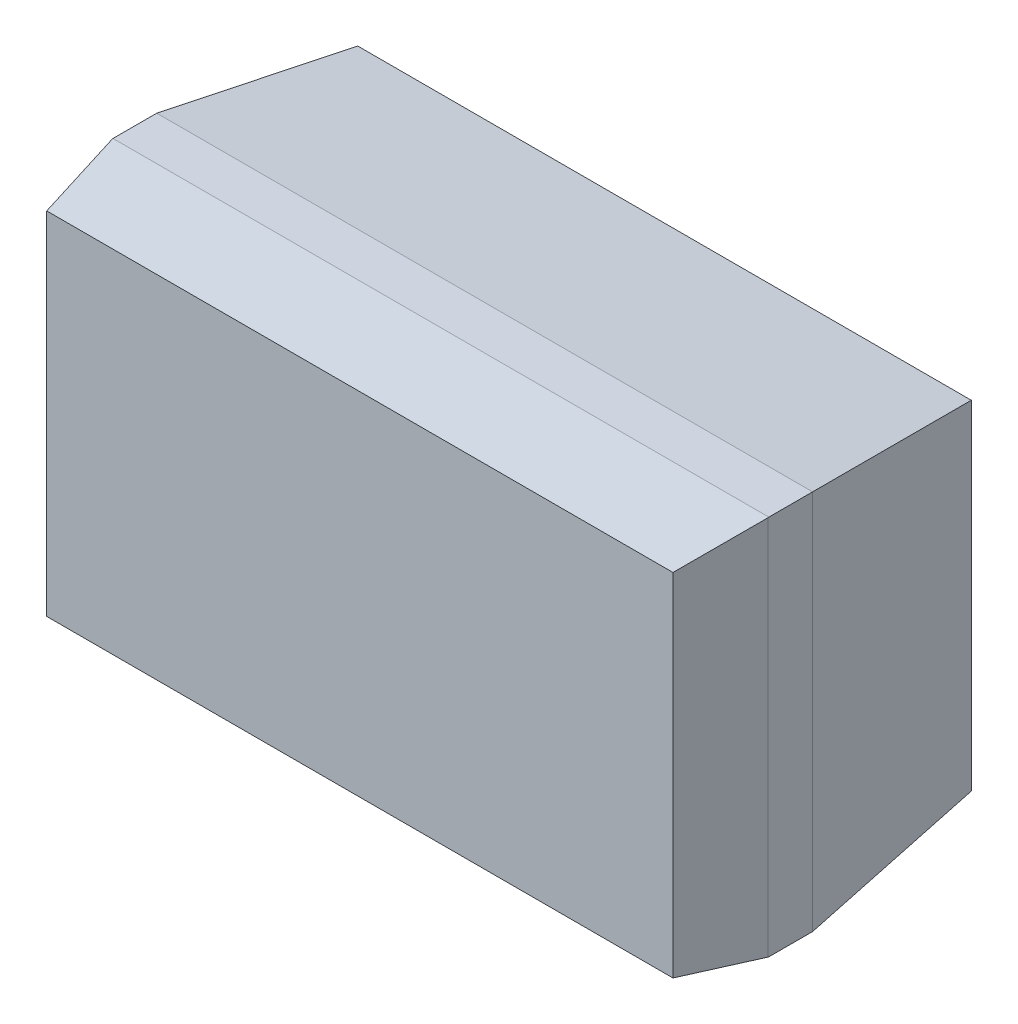
ISO-10303-21;
HEADER;
FILE_DESCRIPTION(('STEP AP214'),'2;1');
FILE_NAME('part.step','',(''),(''),'','','');
FILE_SCHEMA(('AUTOMOTIVE_DESIGN { 1 0 10303 214 1 1 1 1 }'));
ENDSEC;
DATA;
#1=APPLICATION_CONTEXT('core data for automotive mechanical design processes');
#2=APPLICATION_PROTOCOL_DEFINITION('international standard','automotive_design',2000,#1);
#3=PRODUCT_CONTEXT('',#1,'mechanical');
#4=PRODUCT('Part','Part','',(#3));
#5=PRODUCT_RELATED_PRODUCT_CATEGORY('part','',(#4));
#6=PRODUCT_DEFINITION_FORMATION('','',#4);
#7=PRODUCT_DEFINITION_CONTEXT('part definition',#1,'design');
#8=PRODUCT_DEFINITION('design','',#6,#7);
#9=PRODUCT_DEFINITION_SHAPE('','',#8);
#10=(LENGTH_UNIT() NAMED_UNIT(*) SI_UNIT(.MILLI.,.METRE.));
#11=(NAMED_UNIT(*) PLANE_ANGLE_UNIT() SI_UNIT($,.RADIAN.));
#12=(NAMED_UNIT(*) SI_UNIT($,.STERADIAN.) SOLID_ANGLE_UNIT());
#13=UNCERTAINTY_MEASURE_WITH_UNIT(LENGTH_MEASURE(1.E-05),#10,'distance_accuracy_value','');
#14=(GEOMETRIC_REPRESENTATION_CONTEXT(3) GLOBAL_UNCERTAINTY_ASSIGNED_CONTEXT((#13)) GLOBAL_UNIT_ASSIGNED_CONTEXT((#10,
#11,#12)) REPRESENTATION_CONTEXT('',''));
#15=CARTESIAN_POINT('',(0.,0.,0.));
#16=DIRECTION('',(0.,0.,1.));
#17=DIRECTION('',(1.,0.,0.));
#18=AXIS2_PLACEMENT_3D('',#15,#16,#17);
#19=CARTESIAN_POINT('',(2.465000083856,0.770001793975,1.26219372077));
#20=DIRECTION('',(0.983453196507904,4.29881045100458E-08,0.181162386488982));
#21=DIRECTION('',(0.181162386488983,0.,-0.983453196507905));
#22=AXIS2_PLACEMENT_3D('',#19,#20,#21);
#23=PLANE('',#22);
#24=DIRECTION('',(-4.22767887922205E-08,0.999999999999999,-7.78782760367769E-09));
#25=VECTOR('',#24,1.);
#26=CARTESIAN_POINT('',(2.43000008977988,0.770001793975,1.45219373522669));
#27=LINE('',#26,#25);
#28=CARTESIAN_POINT('',(2.43000003092151,2.43000100568263,1.45219375931903));
#29=VERTEX_POINT('',#28);
#30=CARTESIAN_POINT('',(2.43000009097094,0.7700017612796,1.45219372876295));
#31=VERTEX_POINT('',#30);
#32=EDGE_CURVE('E95',#29,#31,#27,.F.);
#33=ORIENTED_EDGE('',*,*,#32,.T.);
#34=DIRECTION('',(0.178307896661466,-0.176818734409441,-0.967957348827937));
#35=VECTOR('',#34,1.);
#36=CARTESIAN_POINT('',(2.43000009216132,0.770001792445,1.45219372229888));
#37=LINE('',#36,#35);
#38=CARTESIAN_POINT('',(2.50000007855674,0.700586420300428,1.07219371939601));
#39=VERTEX_POINT('',#38);
#40=EDGE_CURVE('E90',#31,#39,#37,.T.);
#41=ORIENTED_EDGE('',*,*,#40,.T.);
#42=DIRECTION('',(-4.37113882867399E-08,0.999999999999999,0.));
#43=VECTOR('',#42,1.);
#44=CARTESIAN_POINT('',(2.50000007424008,0.800001735505,1.07219371924));
#45=LINE('',#44,#43);
#46=CARTESIAN_POINT('',(2.50000000060118,2.49941639137867,1.0721937157377));
#47=VERTEX_POINT('',#46);
#48=EDGE_CURVE('E107',#47,#39,#45,.F.);
#49=ORIENTED_EDGE('',*,*,#48,.F.);
#50=DIRECTION('',(-0.178307881203367,-0.176818750001126,0.967957348827316));
#51=VECTOR('',#50,1.);
#52=CARTESIAN_POINT('',(2.49999999995578,2.499416390739,1.07219371923996));
#53=LINE('',#52,#51);
#54=EDGE_CURVE('E19',#47,#29,#53,.T.);
#55=ORIENTED_EDGE('',*,*,#54,.T.);
#56=EDGE_LOOP('',(#33,#41,#49,#55));
#57=FACE_BOUND('',#56,.T.);
#58=ADVANCED_FACE('F16',(#57),#23,.T.);
#59=CARTESIAN_POINT('',(-0.564998796144,0.77000166153,1.262193853215));
#60=DIRECTION('',(0.98345318067021,4.29881038660092E-08,-0.181162472465039));
#61=DIRECTION('',(-0.181162472465039,0.,-0.983453180670211));
#62=AXIS2_PLACEMENT_3D('',#59,#60,#61);
#63=PLANE('',#62);
#64=DIRECTION('',(-4.22767874780081E-08,0.999999999999999,7.78783118295011E-09));
#65=VECTOR('',#64,1.);
#66=CARTESIAN_POINT('',(-0.529998790220267,0.77000166153,1.45219383875734));
#67=LINE('',#66,#65);
#68=CARTESIAN_POINT('',(-0.529998860399351,2.43000091540621,1.45219385168511));
#69=VERTEX_POINT('',#68);
#70=CARTESIAN_POINT('',(-0.529998811882232,0.770001657205666,1.4521938196372));
#71=VERTEX_POINT('',#70);
#72=EDGE_CURVE('E126',#69,#71,#67,.F.);
#73=ORIENTED_EDGE('',*,*,#72,.F.);
#74=DIRECTION('',(0.178307981282763,-0.176818734411621,0.967957333239404));
#75=VECTOR('',#74,1.);
#76=CARTESIAN_POINT('',(-0.59999888004425,2.499416255234,1.07219385474505));
#77=LINE('',#76,#75);
#78=CARTESIAN_POINT('',(-0.59999887948133,2.49941625467585,1.07219385779939));
#79=VERTEX_POINT('',#78);
#80=EDGE_CURVE('E105',#79,#69,#77,.T.);
#81=ORIENTED_EDGE('',*,*,#80,.F.);
#82=DIRECTION('',(-4.37113882867399E-08,0.999999999999999,0.));
#83=VECTOR('',#82,1.);
#84=CARTESIAN_POINT('',(-0.599998805759921,0.8000016,1.072193854745));
#85=LINE('',#84,#83);
#86=CARTESIAN_POINT('',(-0.599998801414521,0.700586284766084,1.07219385474506));
#87=VERTEX_POINT('',#86);
#88=EDGE_CURVE('E137',#79,#87,#85,.F.);
#89=ORIENTED_EDGE('',*,*,#88,.T.);
#90=DIRECTION('',(-0.178307965824744,-0.176818750000839,-0.96795733323922));
#91=VECTOR('',#90,1.);
#92=CARTESIAN_POINT('',(-0.529998787838827,0.77000166306,1.45219385168515));
#93=LINE('',#92,#91);
#94=EDGE_CURVE('E121',#71,#87,#93,.T.);
#95=ORIENTED_EDGE('',*,*,#94,.F.);
#96=EDGE_LOOP('',(#73,#81,#89,#95));
#97=FACE_BOUND('',#96,.T.);
#98=ADVANCED_FACE('F135',(#97),#63,.F.);
#99=CARTESIAN_POINT('',(2.500000027906,0.800001735505,0.01219405923968));
#100=DIRECTION('',(0.999999999999998,4.37113882867399E-08,-4.37114091589299E-08));
#101=DIRECTION('',(-4.371140915893E-08,0.,-0.999999999999999));
#102=AXIS2_PLACEMENT_3D('',#99,#100,#101);
#103=PLANE('',#102);
#104=DIRECTION('',(-3.51450169027995E-08,-0.179698457566805,-0.983721741321249));
#105=VECTOR('',#104,1.);
#106=CARTESIAN_POINT('',(2.50000007858566,0.700586420272,1.07219371924));
#107=LINE('',#106,#105);
#108=CARTESIAN_POINT('',(2.50000007621142,0.700001940399639,1.06899410603391));
#109=VERTEX_POINT('',#108);
#110=EDGE_CURVE('E111',#39,#109,#107,.T.);
#111=ORIENTED_EDGE('',*,*,#110,.T.);
#112=DIRECTION('',(-4.371140915893E-08,0.,-0.999999999999999));
#113=VECTOR('',#112,1.);
#114=CARTESIAN_POINT('',(2.50000003227713,0.700001935505,0.0121940592396798));
#115=LINE('',#114,#113);
#116=CARTESIAN_POINT('',(2.50000008151621,0.700001960479602,0.862194283895587));
#117=VERTEX_POINT('',#116);
#118=EDGE_CURVE('E158',#109,#117,#115,.T.);
#119=ORIENTED_EDGE('',*,*,#118,.T.);
#120=DIRECTION('',(-4.31146453548667E-08,0.999999999999999,5.07231312888606E-09));
#121=VECTOR('',#120,1.);
#122=CARTESIAN_POINT('',(2.49999999506254,2.40000107332,0.862194058732759));
#123=LINE('',#122,#121);
#124=CARTESIAN_POINT('',(2.50000000596844,2.50000085253359,0.862194283981374));
#125=VERTEX_POINT('',#124);
#126=EDGE_CURVE('E151',#125,#117,#123,.F.);
#127=ORIENTED_EDGE('',*,*,#126,.F.);
#128=DIRECTION('',(-4.371140915893E-08,0.,-0.999999999999999));
#129=VECTOR('',#128,1.);
#130=CARTESIAN_POINT('',(2.49999995359668,2.500000875505,0.0121940592396832));
#131=LINE('',#130,#129);
#132=CARTESIAN_POINT('',(2.4999999998322,2.5000008755051,1.06899411311626));
#133=VERTEX_POINT('',#132);
#134=EDGE_CURVE('E117',#125,#133,#131,.F.);
#135=ORIENTED_EDGE('',*,*,#134,.T.);
#136=DIRECTION('',(5.08547138603854E-08,-0.179698457269265,0.9837217413756));
#137=VECTOR('',#136,1.);
#138=CARTESIAN_POINT('',(2.4999999997909,2.500000875505,1.06899407924));
#139=LINE('',#138,#137);
#140=EDGE_CURVE('E112',#133,#47,#139,.T.);
#141=ORIENTED_EDGE('',*,*,#140,.T.);
#142=ORIENTED_EDGE('',*,*,#48,.T.);
#143=EDGE_LOOP('',(#111,#119,#127,#135,#141,#142));
#144=FACE_BOUND('',#143,.T.);
#145=ADVANCED_FACE('F115',(#144),#103,.T.);
#146=CARTESIAN_POINT('',(-0.599998852094,0.8000016,0.012194194745));
#147=DIRECTION('',(0.999999999999998,4.37113882867399E-08,-4.37114091589299E-08));
#148=DIRECTION('',(-4.371140915893E-08,0.,-0.999999999999999));
#149=AXIS2_PLACEMENT_3D('',#146,#147,#148);
#150=PLANE('',#149);
#151=DIRECTION('',(-3.51449835711999E-08,-0.179698457269253,-0.983721741375603));
#152=VECTOR('',#151,1.);
#153=CARTESIAN_POINT('',(-0.59999880141434,0.700586284766,1.072193854745));
#154=LINE('',#153,#152);
#155=CARTESIAN_POINT('',(-0.599998801500076,0.7000018,1.06899418086875));
#156=VERTEX_POINT('',#155);
#157=EDGE_CURVE('E141',#87,#156,#154,.T.);
#158=ORIENTED_EDGE('',*,*,#157,.F.);
#159=ORIENTED_EDGE('',*,*,#88,.F.);
#160=DIRECTION('',(5.08547138603808E-08,-0.179698457269382,0.983721741375579));
#161=VECTOR('',#160,1.);
#162=CARTESIAN_POINT('',(-0.599998880209104,2.50000074,1.068994214745));
#163=LINE('',#162,#161);
#164=CARTESIAN_POINT('',(-0.599998882469052,2.50000074708232,1.06899417597425));
#165=VERTEX_POINT('',#164);
#166=EDGE_CURVE('E142',#165,#79,#163,.T.);
#167=ORIENTED_EDGE('',*,*,#166,.F.);
#168=DIRECTION('',(-4.371140915893E-08,0.,-0.999999999999999));
#169=VECTOR('',#168,1.);
#170=CARTESIAN_POINT('',(-0.599998926403322,2.50000074,0.0121941947450032));
#171=LINE('',#170,#169);
#172=CARTESIAN_POINT('',(-0.599998913954698,2.50000071529425,0.862194580868761));
#173=VERTEX_POINT('',#172);
#174=EDGE_CURVE('E156',#173,#165,#171,.F.);
#175=ORIENTED_EDGE('',*,*,#174,.F.);
#176=DIRECTION('',(-4.31146462151127E-08,0.999999999999999,-5.07230940872281E-09));
#177=VECTOR('',#176,1.);
#178=CARTESIAN_POINT('',(-0.599998884937224,2.400000942186,0.862194195252268));
#179=LINE('',#178,#177);
#180=CARTESIAN_POINT('',(-0.599998819862986,0.700001826633969,0.862194388355148));
#181=VERTEX_POINT('',#180);
#182=EDGE_CURVE('E184',#173,#181,#179,.F.);
#183=ORIENTED_EDGE('',*,*,#182,.T.);
#184=DIRECTION('',(-4.371140915893E-08,0.,-0.999999999999999));
#185=VECTOR('',#184,1.);
#186=CARTESIAN_POINT('',(-0.59999884772287,0.7000018,0.0121941947449998));
#187=LINE('',#186,#185);
#188=EDGE_CURVE('E147',#156,#181,#187,.T.);
#189=ORIENTED_EDGE('',*,*,#188,.F.);
#190=EDGE_LOOP('',(#158,#159,#167,#175,#183,#189));
#191=FACE_BOUND('',#190,.T.);
#192=ADVANCED_FACE('F145',(#191),#150,.F.);
#193=CARTESIAN_POINT('',(2.449999976545,2.40000107332,0.437194061425));
#194=DIRECTION('',(0.993150599215632,4.34119914833839E-08,-0.116841290978957));
#195=DIRECTION('',(-0.116841290978957,0.,-0.993150599215633));
#196=AXIS2_PLACEMENT_3D('',#193,#194,#195);
#197=PLANE('',#196);
#198=DIRECTION('',(0.,1.,0.));
#199=VECTOR('',#198,1.);
#200=CARTESIAN_POINT('',(2.399999957968,2.40000094,0.0121940636108215));
#201=LINE('',#200,#199);
#202=CARTESIAN_POINT('',(2.39999995844533,2.40000103992069,0.01219406766866));
#203=VERTEX_POINT('',#202);
#204=CARTESIAN_POINT('',(2.4000000145316,0.800001727023977,0.0121940985463589));
#205=VERTEX_POINT('',#204);
#206=EDGE_CURVE('E179',#203,#205,#201,.F.);
#207=ORIENTED_EDGE('',*,*,#206,.F.);
#208=DIRECTION('',(0.116051813353159,0.116051433590884,0.986440085042647));
#209=VECTOR('',#208,1.);
#210=CARTESIAN_POINT('',(2.39999995796788,2.400001071134,0.0121940636108342));
#211=LINE('',#210,#209);
#212=EDGE_CURVE('E187',#203,#125,#211,.T.);
#213=ORIENTED_EDGE('',*,*,#212,.T.);
#214=ORIENTED_EDGE('',*,*,#126,.T.);
#215=DIRECTION('',(-0.116051823498709,0.116051423444477,-0.986440085042744));
#216=VECTOR('',#215,1.);
#217=CARTESIAN_POINT('',(2.50000006943154,0.700002034328999,0.862194059240054));
#218=LINE('',#217,#216);
#219=EDGE_CURVE('E190',#117,#205,#218,.T.);
#220=ORIENTED_EDGE('',*,*,#219,.T.);
#221=EDGE_LOOP('',(#207,#213,#214,#220));
#222=FACE_BOUND('',#221,.T.);
#223=ADVANCED_FACE('F194',(#222),#197,.T.);
#224=CARTESIAN_POINT('',(-0.549998903455,2.400000942186,0.437194192559));
#225=DIRECTION('',(0.993150609430212,4.34119919030693E-08,0.116841204155025));
#226=DIRECTION('',(0.116841204155025,0.,-0.993150609430213));
#227=AXIS2_PLACEMENT_3D('',#224,#225,#226);
#228=PLANE('',#227);
#229=DIRECTION('',(0.116051727115878,0.116051433590921,-0.986440095188205));
#230=VECTOR('',#229,1.);
#231=CARTESIAN_POINT('',(-0.599998810568224,0.700001898822999,0.862194194744974));
#232=LINE('',#231,#230);
#233=CARTESIAN_POINT('',(-0.499998852094179,0.800001636061784,0.0121941903738426));
#234=VERTEX_POINT('',#233);
#235=EDGE_CURVE('E182',#181,#234,#232,.T.);
#236=ORIENTED_EDGE('',*,*,#235,.F.);
#237=ORIENTED_EDGE('',*,*,#182,.F.);
#238=DIRECTION('',(-0.116051737261413,0.116051423445659,0.986440095188169));
#239=VECTOR('',#238,1.);
#240=CARTESIAN_POINT('',(-0.499998922032548,2.400000944371,0.0121941903737954));
#241=LINE('',#240,#239);
#242=CARTESIAN_POINT('',(-0.499998900825594,2.40000094064888,0.0121941587352762));
#243=VERTEX_POINT('',#242);
#244=EDGE_CURVE('E34',#243,#173,#241,.T.);
#245=ORIENTED_EDGE('',*,*,#244,.F.);
#246=DIRECTION('',(0.,1.,0.));
#247=VECTOR('',#246,1.);
#248=CARTESIAN_POINT('',(-0.499998852094,2.40000094,0.012194190373856));
#249=LINE('',#248,#247);
#250=EDGE_CURVE('E177',#234,#243,#249,.T.);
#251=ORIENTED_EDGE('',*,*,#250,.F.);
#252=EDGE_LOOP('',(#236,#237,#245,#251));
#253=FACE_BOUND('',#252,.T.);
#254=ADVANCED_FACE('F203',(#253),#228,.F.);
#255=CARTESIAN_POINT('',(-0.599998922032,2.40000094,0.012194194745));
#256=DIRECTION('',(-4.371140915893E-08,0.,-0.999999999999999));
#257=DIRECTION('',(-0.999999999999999,0.,4.371140915893E-08));
#258=AXIS2_PLACEMENT_3D('',#255,#256,#257);
#259=PLANE('',#258);
#260=DIRECTION('',(0.999999999999999,3.80423503548877E-08,4.47555725593908E-09));
#261=VECTOR('',#260,1.);
#262=CARTESIAN_POINT('',(-0.599998852094,0.800001600566902,0.0121941899263204));
#263=LINE('',#262,#261);
#264=EDGE_CURVE('E174',#234,#205,#263,.T.);
#265=ORIENTED_EDGE('',*,*,#264,.F.);
#266=ORIENTED_EDGE('',*,*,#250,.T.);
#267=DIRECTION('',(0.999999999999999,4.81869482497015E-08,-5.66903579480872E-09));
#268=VECTOR('',#267,1.);
#269=CARTESIAN_POINT('',(-0.599998889249,2.40000092657339,0.0121940806179003));
#270=LINE('',#269,#268);
#271=EDGE_CURVE('E171',#203,#243,#270,.F.);
#272=ORIENTED_EDGE('',*,*,#271,.F.);
#273=ORIENTED_EDGE('',*,*,#206,.T.);
#274=EDGE_LOOP('',(#265,#266,#272,#273));
#275=FACE_BOUND('',#274,.T.);
#276=ADVANCED_FACE('F269',(#275),#259,.T.);
#277=CARTESIAN_POINT('',(-0.599998852094,0.8000016,0.012194194745));
#278=DIRECTION('',(3.83047129381649E-08,-0.993150644838386,-0.116840903185045));
#279=DIRECTION('',(0.,0.116840903185045,-0.993150644838386));
#280=AXIS2_PLACEMENT_3D('',#277,#278,#279);
#281=PLANE('',#280);
#282=DIRECTION('',(0.999999999999999,4.371138828674E-08,0.));
#283=VECTOR('',#282,1.);
#284=CARTESIAN_POINT('',(-0.599998810568,0.7000018,0.862195034745));
#285=LINE('',#284,#283);
#286=EDGE_CURVE('E166',#181,#117,#285,.T.);
#287=ORIENTED_EDGE('',*,*,#286,.F.);
#288=ORIENTED_EDGE('',*,*,#235,.T.);
#289=ORIENTED_EDGE('',*,*,#264,.T.);
#290=ORIENTED_EDGE('',*,*,#219,.F.);
#291=EDGE_LOOP('',(#287,#288,#289,#290));
#292=FACE_BOUND('',#291,.T.);
#293=ADVANCED_FACE('F206',(#292),#281,.T.);
#294=CARTESIAN_POINT('',(-0.599998889249,2.50000074,0.862195034745));
#295=DIRECTION('',(-4.85192739894388E-08,0.993150644838385,-0.116840903185045));
#296=DIRECTION('',(0.,0.116840903185045,0.993150644838386));
#297=AXIS2_PLACEMENT_3D('',#294,#295,#296);
#298=PLANE('',#297);
#299=DIRECTION('',(-0.999999999999999,-4.371138828674E-08,0.));
#300=VECTOR('',#299,1.);
#301=CARTESIAN_POINT('',(-0.599998880209,2.50000074,0.86219489924));
#302=LINE('',#301,#300);
#303=EDGE_CURVE('E162',#125,#173,#302,.T.);
#304=ORIENTED_EDGE('',*,*,#303,.F.);
#305=ORIENTED_EDGE('',*,*,#212,.F.);
#306=ORIENTED_EDGE('',*,*,#271,.T.);
#307=ORIENTED_EDGE('',*,*,#244,.T.);
#308=EDGE_LOOP('',(#304,#305,#306,#307));
#309=FACE_BOUND('',#308,.T.);
#310=ADVANCED_FACE('F197',(#309),#298,.T.);
#311=CARTESIAN_POINT('',(-0.599998810568,0.7000018,0.862195034745));
#312=DIRECTION('',(4.371138828674E-08,-0.999999999999999,0.));
#313=DIRECTION('',(0.999999999999999,4.371138828674E-08,0.));
#314=AXIS2_PLACEMENT_3D('',#311,#312,#313);
#315=PLANE('',#314);
#316=DIRECTION('',(0.999999999999999,5.00268895809503E-08,-9.13851397902948E-09));
#317=VECTOR('',#316,1.);
#318=CARTESIAN_POINT('',(-0.599998801529,0.7000018,1.068994214745));
#319=LINE('',#318,#317);
#320=EDGE_CURVE('E160',#156,#109,#319,.T.);
#321=ORIENTED_EDGE('',*,*,#320,.F.);
#322=ORIENTED_EDGE('',*,*,#188,.T.);
#323=ORIENTED_EDGE('',*,*,#286,.T.);
#324=ORIENTED_EDGE('',*,*,#118,.F.);
#325=EDGE_LOOP('',(#321,#322,#323,#324));
#326=FACE_BOUND('',#325,.T.);
#327=ADVANCED_FACE('F207',(#326),#315,.T.);
#328=CARTESIAN_POINT('',(-0.599998880209,2.50000074,1.068994214745));
#329=DIRECTION('',(-4.371138828674E-08,0.999999999999999,0.));
#330=DIRECTION('',(-0.999999999999999,-4.371138828674E-08,0.));
#331=AXIS2_PLACEMENT_3D('',#328,#329,#330);
#332=PLANE('',#331);
#333=ORIENTED_EDGE('',*,*,#303,.T.);
#334=ORIENTED_EDGE('',*,*,#174,.T.);
#335=DIRECTION('',(0.999999999999999,3.45728712920151E-08,6.3154969306262E-09));
#336=VECTOR('',#335,1.);
#337=CARTESIAN_POINT('',(-0.599998860399,2.50000076832927,1.06899405966199));
#338=LINE('',#337,#336);
#339=EDGE_CURVE('E133',#133,#165,#338,.F.);
#340=ORIENTED_EDGE('',*,*,#339,.F.);
#341=ORIENTED_EDGE('',*,*,#134,.F.);
#342=EDGE_LOOP('',(#333,#334,#340,#341));
#343=FACE_BOUND('',#342,.T.);
#344=ADVANCED_FACE('F200',(#343),#332,.T.);
#345=CARTESIAN_POINT('',(-0.599998801529,0.7000018,1.068994214745));
#346=DIRECTION('',(5.08547157979425E-08,-0.983721741356662,0.179698457372938));
#347=DIRECTION('',(0.,-0.179698457372939,-0.983721741356663));
#348=AXIS2_PLACEMENT_3D('',#345,#346,#347);
#349=PLANE('',#348);
#350=ORIENTED_EDGE('',*,*,#110,.F.);
#351=ORIENTED_EDGE('',*,*,#40,.F.);
#352=DIRECTION('',(0.999999999999999,0.,-4.371140915893E-08));
#353=VECTOR('',#352,1.);
#354=CARTESIAN_POINT('',(-0.599998787838,0.77000166306,1.452193854745));
#355=LINE('',#354,#353);
#356=EDGE_CURVE('E25',#71,#31,#355,.T.);
#357=ORIENTED_EDGE('',*,*,#356,.F.);
#358=ORIENTED_EDGE('',*,*,#94,.T.);
#359=ORIENTED_EDGE('',*,*,#157,.T.);
#360=ORIENTED_EDGE('',*,*,#320,.T.);
#361=EDGE_LOOP('',(#350,#351,#357,#358,#359,#360));
#362=FACE_BOUND('',#361,.T.);
#363=ADVANCED_FACE('F131',(#362),#349,.T.);
#364=CARTESIAN_POINT('',(-0.599998860399,2.43000088,1.452193854745));
#365=DIRECTION('',(-3.5144970207058E-08,0.983721741356663,0.179698457372938));
#366=DIRECTION('',(0.,-0.179698457372939,0.983721741356663));
#367=AXIS2_PLACEMENT_3D('',#364,#365,#366);
#368=PLANE('',#367);
#369=ORIENTED_EDGE('',*,*,#166,.T.);
#370=ORIENTED_EDGE('',*,*,#80,.T.);
#371=DIRECTION('',(0.999999999999999,0.,-4.371140915893E-08));
#372=VECTOR('',#371,1.);
#373=CARTESIAN_POINT('',(-0.599998787838,2.430001012445,1.452193854745));
#374=LINE('',#373,#372);
#375=EDGE_CURVE('E10',#29,#69,#374,.F.);
#376=ORIENTED_EDGE('',*,*,#375,.F.);
#377=ORIENTED_EDGE('',*,*,#54,.F.);
#378=ORIENTED_EDGE('',*,*,#140,.F.);
#379=ORIENTED_EDGE('',*,*,#339,.T.);
#380=EDGE_LOOP('',(#369,#370,#376,#377,#378,#379));
#381=FACE_BOUND('',#380,.T.);
#382=ADVANCED_FACE('F102',(#381),#368,.T.);
#383=CARTESIAN_POINT('',(-0.599998787838,0.77000166,1.452193854745));
#384=DIRECTION('',(4.371140915893E-08,0.,0.999999999999999));
#385=DIRECTION('',(0.999999999999999,0.,-4.371140915893E-08));
#386=AXIS2_PLACEMENT_3D('',#383,#384,#385);
#387=PLANE('',#386);
#388=ORIENTED_EDGE('',*,*,#375,.T.);
#389=ORIENTED_EDGE('',*,*,#72,.T.);
#390=ORIENTED_EDGE('',*,*,#356,.T.);
#391=ORIENTED_EDGE('',*,*,#32,.F.);
#392=EDGE_LOOP('',(#388,#389,#390,#391));
#393=FACE_BOUND('',#392,.T.);
#394=ADVANCED_FACE('F97',(#393),#387,.T.);
#395=CLOSED_SHELL('',(#58,#98,#145,#192,#223,#254,#276,#293,#310,#327,#344,#363,#382,#394));
#396=MANIFOLD_SOLID_BREP('B1',#395);
#397=ADVANCED_BREP_SHAPE_REPRESENTATION('',(#18,#396),#14);
#398=SHAPE_DEFINITION_REPRESENTATION(#9,#397);
ENDSEC;
END-ISO-10303-21;
